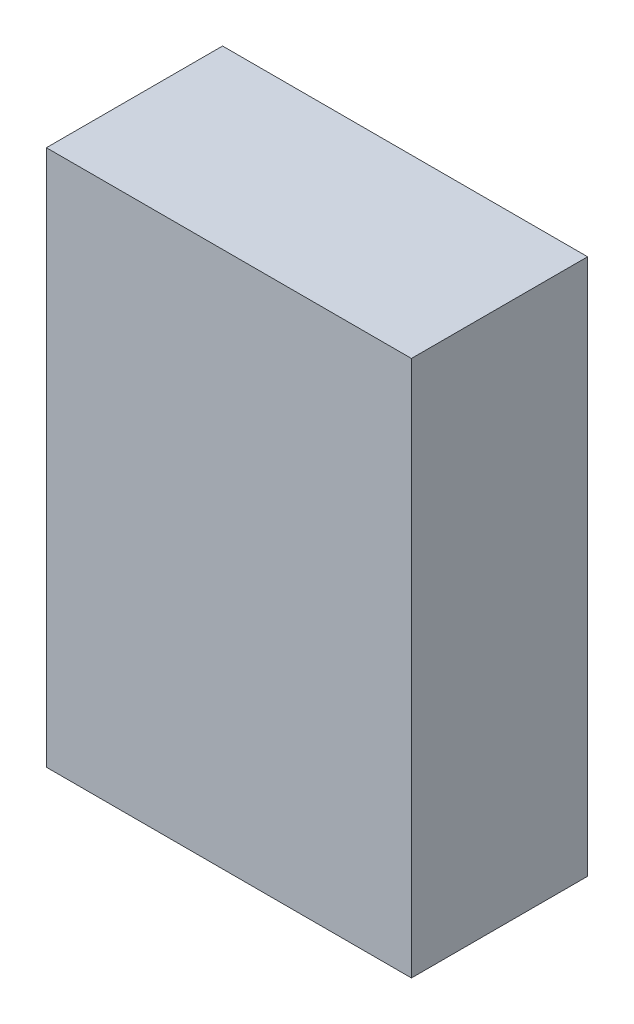
ISO-10303-21;
HEADER;
FILE_DESCRIPTION(('STEP AP214'),'2;1');
FILE_NAME('part.step','',(''),(''),'','','');
FILE_SCHEMA(('AUTOMOTIVE_DESIGN { 1 0 10303 214 1 1 1 1 }'));
ENDSEC;
DATA;
#1=APPLICATION_CONTEXT('core data for automotive mechanical design processes');
#2=APPLICATION_PROTOCOL_DEFINITION('international standard','automotive_design',2000,#1);
#3=PRODUCT_CONTEXT('',#1,'mechanical');
#4=PRODUCT('Part','Part','',(#3));
#5=PRODUCT_RELATED_PRODUCT_CATEGORY('part','',(#4));
#6=PRODUCT_DEFINITION_FORMATION('','',#4);
#7=PRODUCT_DEFINITION_CONTEXT('part definition',#1,'design');
#8=PRODUCT_DEFINITION('design','',#6,#7);
#9=PRODUCT_DEFINITION_SHAPE('','',#8);
#10=(LENGTH_UNIT() NAMED_UNIT(*) SI_UNIT(.MILLI.,.METRE.));
#11=(NAMED_UNIT(*) PLANE_ANGLE_UNIT() SI_UNIT($,.RADIAN.));
#12=(NAMED_UNIT(*) SI_UNIT($,.STERADIAN.) SOLID_ANGLE_UNIT());
#13=UNCERTAINTY_MEASURE_WITH_UNIT(LENGTH_MEASURE(1.E-05),#10,'distance_accuracy_value','');
#14=(GEOMETRIC_REPRESENTATION_CONTEXT(3) GLOBAL_UNCERTAINTY_ASSIGNED_CONTEXT((#13)) GLOBAL_UNIT_ASSIGNED_CONTEXT((#10,
#11,#12)) REPRESENTATION_CONTEXT('',''));
#15=CARTESIAN_POINT('',(0.,0.,0.));
#16=DIRECTION('',(0.,0.,1.));
#17=DIRECTION('',(1.,0.,0.));
#18=AXIS2_PLACEMENT_3D('',#15,#16,#17);
#19=CARTESIAN_POINT('',(13.78,-20.255,13.3));
#20=DIRECTION('',(-1.,0.,0.));
#21=DIRECTION('',(0.,0.,1.));
#22=AXIS2_PLACEMENT_3D('',#19,#20,#21);
#23=PLANE('',#22);
#24=DIRECTION('',(0.,1.,0.));
#25=VECTOR('',#24,1.);
#26=CARTESIAN_POINT('',(13.78,-20.255,0.));
#27=LINE('',#26,#25);
#28=CARTESIAN_POINT('',(13.78,-20.255,0.));
#29=VERTEX_POINT('',#28);
#30=CARTESIAN_POINT('',(13.78,20.255,0.));
#31=VERTEX_POINT('',#30);
#32=EDGE_CURVE('E102',#29,#31,#27,.T.);
#33=ORIENTED_EDGE('',*,*,#32,.T.);
#34=DIRECTION('',(0.,0.,-1.));
#35=VECTOR('',#34,1.);
#36=CARTESIAN_POINT('',(13.78,20.255,13.3));
#37=LINE('',#36,#35);
#38=CARTESIAN_POINT('',(13.78,20.255,13.3));
#39=VERTEX_POINT('',#38);
#40=EDGE_CURVE('E11',#39,#31,#37,.T.);
#41=ORIENTED_EDGE('',*,*,#40,.F.);
#42=DIRECTION('',(0.,1.,0.));
#43=VECTOR('',#42,1.);
#44=CARTESIAN_POINT('',(13.78,-20.255,13.3));
#45=LINE('',#44,#43);
#46=CARTESIAN_POINT('',(13.78,-20.255,13.3));
#47=VERTEX_POINT('',#46);
#48=EDGE_CURVE('E90',#47,#39,#45,.T.);
#49=ORIENTED_EDGE('',*,*,#48,.F.);
#50=DIRECTION('',(0.,0.,-1.));
#51=VECTOR('',#50,1.);
#52=CARTESIAN_POINT('',(13.78,-20.255,13.3));
#53=LINE('',#52,#51);
#54=EDGE_CURVE('E98',#47,#29,#53,.T.);
#55=ORIENTED_EDGE('',*,*,#54,.T.);
#56=EDGE_LOOP('',(#33,#41,#49,#55));
#57=FACE_BOUND('',#56,.T.);
#58=ADVANCED_FACE('F39',(#57),#23,.F.);
#59=CARTESIAN_POINT('',(-13.78,20.255,13.3));
#60=DIRECTION('',(0.,-1.,0.));
#61=DIRECTION('',(0.,0.,-1.));
#62=AXIS2_PLACEMENT_3D('',#59,#60,#61);
#63=PLANE('',#62);
#64=DIRECTION('',(-1.,0.,0.));
#65=VECTOR('',#64,1.);
#66=CARTESIAN_POINT('',(-13.78,20.255,0.));
#67=LINE('',#66,#65);
#68=CARTESIAN_POINT('',(-13.78,20.255,0.));
#69=VERTEX_POINT('',#68);
#70=EDGE_CURVE('E94',#31,#69,#67,.T.);
#71=ORIENTED_EDGE('',*,*,#70,.T.);
#72=DIRECTION('',(0.,0.,-1.));
#73=VECTOR('',#72,1.);
#74=CARTESIAN_POINT('',(-13.78,20.255,13.3));
#75=LINE('',#74,#73);
#76=CARTESIAN_POINT('',(-13.78,20.255,13.3));
#77=VERTEX_POINT('',#76);
#78=EDGE_CURVE('E47',#77,#69,#75,.T.);
#79=ORIENTED_EDGE('',*,*,#78,.F.);
#80=DIRECTION('',(-1.,0.,0.));
#81=VECTOR('',#80,1.);
#82=CARTESIAN_POINT('',(-13.78,20.255,13.3));
#83=LINE('',#82,#81);
#84=EDGE_CURVE('E85',#39,#77,#83,.T.);
#85=ORIENTED_EDGE('',*,*,#84,.F.);
#86=ORIENTED_EDGE('',*,*,#40,.T.);
#87=EDGE_LOOP('',(#71,#79,#85,#86));
#88=FACE_BOUND('',#87,.T.);
#89=ADVANCED_FACE('F93',(#88),#63,.F.);
#90=CARTESIAN_POINT('',(-13.78,-20.255,13.3));
#91=DIRECTION('',(1.,0.,0.));
#92=DIRECTION('',(0.,0.,-1.));
#93=AXIS2_PLACEMENT_3D('',#90,#91,#92);
#94=PLANE('',#93);
#95=DIRECTION('',(0.,-1.,0.));
#96=VECTOR('',#95,1.);
#97=CARTESIAN_POINT('',(-13.78,-20.255,0.));
#98=LINE('',#97,#96);
#99=CARTESIAN_POINT('',(-13.78,-20.255,0.));
#100=VERTEX_POINT('',#99);
#101=EDGE_CURVE('E72',#69,#100,#98,.T.);
#102=ORIENTED_EDGE('',*,*,#101,.T.);
#103=DIRECTION('',(0.,0.,-1.));
#104=VECTOR('',#103,1.);
#105=CARTESIAN_POINT('',(-13.78,-20.255,13.3));
#106=LINE('',#105,#104);
#107=CARTESIAN_POINT('',(-13.78,-20.255,13.3));
#108=VERTEX_POINT('',#107);
#109=EDGE_CURVE('E95',#108,#100,#106,.T.);
#110=ORIENTED_EDGE('',*,*,#109,.F.);
#111=DIRECTION('',(0.,-1.,0.));
#112=VECTOR('',#111,1.);
#113=CARTESIAN_POINT('',(-13.78,-20.255,13.3));
#114=LINE('',#113,#112);
#115=EDGE_CURVE('E88',#77,#108,#114,.T.);
#116=ORIENTED_EDGE('',*,*,#115,.F.);
#117=ORIENTED_EDGE('',*,*,#78,.T.);
#118=EDGE_LOOP('',(#102,#110,#116,#117));
#119=FACE_BOUND('',#118,.T.);
#120=ADVANCED_FACE('F96',(#119),#94,.F.);
#121=CARTESIAN_POINT('',(-13.78,-20.255,13.3));
#122=DIRECTION('',(0.,1.,0.));
#123=DIRECTION('',(0.,0.,1.));
#124=AXIS2_PLACEMENT_3D('',#121,#122,#123);
#125=PLANE('',#124);
#126=DIRECTION('',(1.,0.,0.));
#127=VECTOR('',#126,1.);
#128=CARTESIAN_POINT('',(-13.78,-20.255,0.));
#129=LINE('',#128,#127);
#130=EDGE_CURVE('E78',#100,#29,#129,.T.);
#131=ORIENTED_EDGE('',*,*,#130,.T.);
#132=ORIENTED_EDGE('',*,*,#54,.F.);
#133=DIRECTION('',(1.,0.,0.));
#134=VECTOR('',#133,1.);
#135=CARTESIAN_POINT('',(-13.78,-20.255,13.3));
#136=LINE('',#135,#134);
#137=EDGE_CURVE('E55',#108,#47,#136,.T.);
#138=ORIENTED_EDGE('',*,*,#137,.F.);
#139=ORIENTED_EDGE('',*,*,#109,.T.);
#140=EDGE_LOOP('',(#131,#132,#138,#139));
#141=FACE_BOUND('',#140,.T.);
#142=ADVANCED_FACE('F109',(#141),#125,.F.);
#143=CARTESIAN_POINT('',(0.,0.,13.3));
#144=DIRECTION('',(0.,0.,-1.));
#145=DIRECTION('',(-1.,0.,0.));
#146=AXIS2_PLACEMENT_3D('',#143,#144,#145);
#147=PLANE('',#146);
#148=ORIENTED_EDGE('',*,*,#48,.T.);
#149=ORIENTED_EDGE('',*,*,#84,.T.);
#150=ORIENTED_EDGE('',*,*,#115,.T.);
#151=ORIENTED_EDGE('',*,*,#137,.T.);
#152=EDGE_LOOP('',(#148,#149,#150,#151));
#153=FACE_BOUND('',#152,.T.);
#154=ADVANCED_FACE('F86',(#153),#147,.F.);
#155=CARTESIAN_POINT('',(0.,0.,0.));
#156=DIRECTION('',(0.,0.,-1.));
#157=DIRECTION('',(-1.,0.,0.));
#158=AXIS2_PLACEMENT_3D('',#155,#156,#157);
#159=PLANE('',#158);
#160=ORIENTED_EDGE('',*,*,#32,.F.);
#161=ORIENTED_EDGE('',*,*,#130,.F.);
#162=ORIENTED_EDGE('',*,*,#101,.F.);
#163=ORIENTED_EDGE('',*,*,#70,.F.);
#164=EDGE_LOOP('',(#160,#161,#162,#163));
#165=FACE_BOUND('',#164,.T.);
#166=ADVANCED_FACE('F112',(#165),#159,.T.);
#167=CLOSED_SHELL('',(#58,#89,#120,#142,#154,#166));
#168=MANIFOLD_SOLID_BREP('B2',#167);
#169=ADVANCED_BREP_SHAPE_REPRESENTATION('',(#18,#168),#14);
#170=SHAPE_DEFINITION_REPRESENTATION(#9,#169);
ENDSEC;
END-ISO-10303-21;
